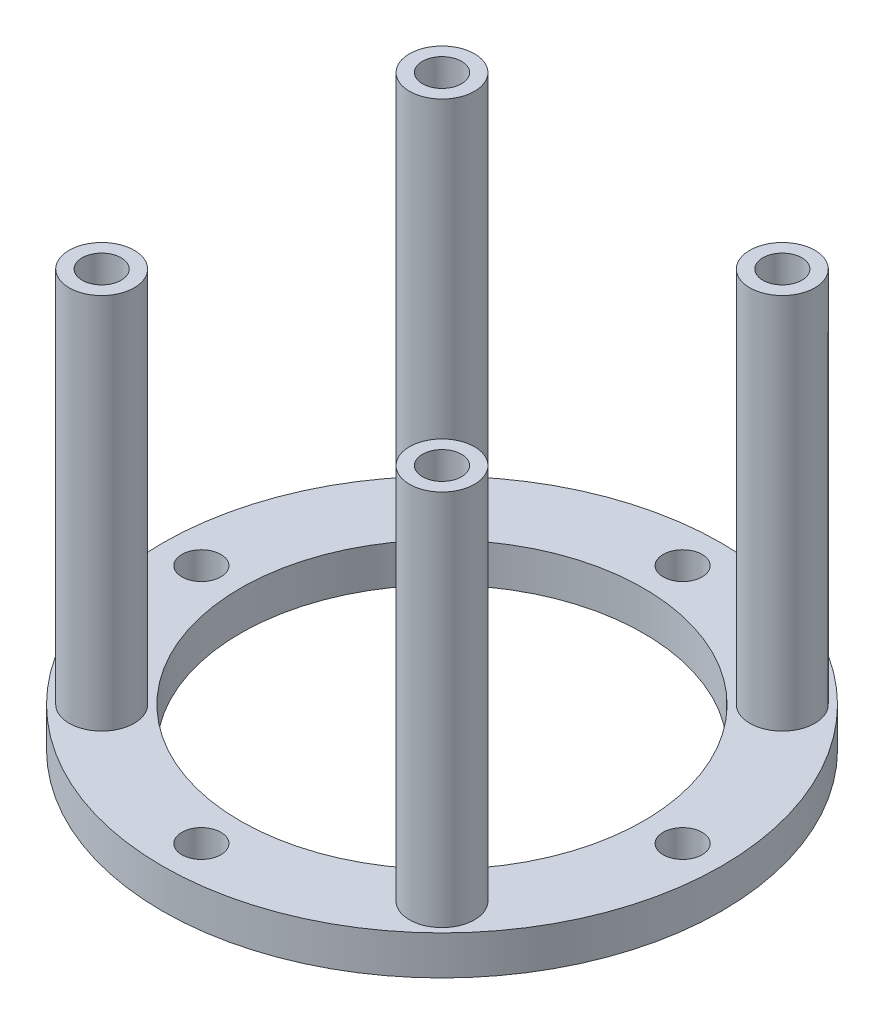
ISO-10303-21;
HEADER;
FILE_DESCRIPTION(('STEP AP214'),'2;1');
FILE_NAME('part.step','',(''),(''),'','','');
FILE_SCHEMA(('AUTOMOTIVE_DESIGN { 1 0 10303 214 1 1 1 1 }'));
ENDSEC;
DATA;
#1=APPLICATION_CONTEXT('core data for automotive mechanical design processes');
#2=APPLICATION_PROTOCOL_DEFINITION('international standard','automotive_design',2000,#1);
#3=PRODUCT_CONTEXT('',#1,'mechanical');
#4=PRODUCT('Part','Part','',(#3));
#5=PRODUCT_RELATED_PRODUCT_CATEGORY('part','',(#4));
#6=PRODUCT_DEFINITION_FORMATION('','',#4);
#7=PRODUCT_DEFINITION_CONTEXT('part definition',#1,'design');
#8=PRODUCT_DEFINITION('design','',#6,#7);
#9=PRODUCT_DEFINITION_SHAPE('','',#8);
#10=(LENGTH_UNIT() NAMED_UNIT(*) SI_UNIT(.MILLI.,.METRE.));
#11=(NAMED_UNIT(*) PLANE_ANGLE_UNIT() SI_UNIT($,.RADIAN.));
#12=(NAMED_UNIT(*) SI_UNIT($,.STERADIAN.) SOLID_ANGLE_UNIT());
#13=UNCERTAINTY_MEASURE_WITH_UNIT(LENGTH_MEASURE(1.E-05),#10,'distance_accuracy_value','');
#14=(GEOMETRIC_REPRESENTATION_CONTEXT(3) GLOBAL_UNCERTAINTY_ASSIGNED_CONTEXT((#13)) GLOBAL_UNIT_ASSIGNED_CONTEXT((#10,
#11,#12)) REPRESENTATION_CONTEXT('',''));
#15=CARTESIAN_POINT('',(0.,0.,0.));
#16=DIRECTION('',(0.,0.,1.));
#17=DIRECTION('',(1.,0.,0.));
#18=AXIS2_PLACEMENT_3D('',#15,#16,#17);
#19=CARTESIAN_POINT('',(0.,3.,0.));
#20=DIRECTION('',(0.,1.,0.));
#21=DIRECTION('',(0.,0.,1.));
#22=AXIS2_PLACEMENT_3D('',#19,#20,#21);
#23=PLANE('',#22);
#24=CARTESIAN_POINT('',(-13.0814754519511,3.,13.0814754519512));
#25=DIRECTION('',(0.,1.,0.));
#26=DIRECTION('',(0.,0.,1.));
#27=AXIS2_PLACEMENT_3D('',#24,#25,#26);
#28=CIRCLE('',#27,2.5);
#29=CARTESIAN_POINT('',(-13.0814754519511,3.,10.5814754519512));
#30=VERTEX_POINT('',#29);
#31=EDGE_CURVE('E118',#30,#30,#28,.T.);
#32=ORIENTED_EDGE('',*,*,#31,.F.);
#33=EDGE_LOOP('',(#32));
#34=FACE_BOUND('',#33,.T.);
#35=CARTESIAN_POINT('',(13.0814754519512,3.,13.0814754519511));
#36=DIRECTION('',(0.,1.,0.));
#37=DIRECTION('',(0.,0.,1.));
#38=AXIS2_PLACEMENT_3D('',#35,#36,#37);
#39=CIRCLE('',#38,2.5);
#40=CARTESIAN_POINT('',(13.0814754519512,3.,10.5814754519511));
#41=VERTEX_POINT('',#40);
#42=EDGE_CURVE('E110',#41,#41,#39,.T.);
#43=ORIENTED_EDGE('',*,*,#42,.F.);
#44=EDGE_LOOP('',(#43));
#45=FACE_BOUND('',#44,.T.);
#46=CARTESIAN_POINT('',(13.0814754519511,3.,-13.0814754519512));
#47=DIRECTION('',(0.,1.,0.));
#48=DIRECTION('',(0.,0.,1.));
#49=AXIS2_PLACEMENT_3D('',#46,#47,#48);
#50=CIRCLE('',#49,2.5);
#51=CARTESIAN_POINT('',(13.0814754519511,3.,-15.5814754519512));
#52=VERTEX_POINT('',#51);
#53=EDGE_CURVE('E102',#52,#52,#50,.T.);
#54=ORIENTED_EDGE('',*,*,#53,.F.);
#55=EDGE_LOOP('',(#54));
#56=FACE_BOUND('',#55,.T.);
#57=CARTESIAN_POINT('',(-13.0814754519512,3.,-13.0814754519511));
#58=DIRECTION('',(0.,1.,0.));
#59=DIRECTION('',(0.,0.,1.));
#60=AXIS2_PLACEMENT_3D('',#57,#58,#59);
#61=CIRCLE('',#60,2.5);
#62=CARTESIAN_POINT('',(-13.0814754519512,3.,-15.5814754519511));
#63=VERTEX_POINT('',#62);
#64=EDGE_CURVE('E98',#63,#63,#61,.T.);
#65=ORIENTED_EDGE('',*,*,#64,.F.);
#66=EDGE_LOOP('',(#65));
#67=FACE_BOUND('',#66,.T.);
#68=CARTESIAN_POINT('',(0.,3.,18.5));
#69=DIRECTION('',(0.,1.,0.));
#70=DIRECTION('',(0.,0.,1.));
#71=AXIS2_PLACEMENT_3D('',#68,#69,#70);
#72=CIRCLE('',#71,1.5);
#73=CARTESIAN_POINT('',(0.,3.,20.));
#74=VERTEX_POINT('',#73);
#75=EDGE_CURVE('E78',#74,#74,#72,.T.);
#76=ORIENTED_EDGE('',*,*,#75,.F.);
#77=EDGE_LOOP('',(#76));
#78=FACE_BOUND('',#77,.T.);
#79=CARTESIAN_POINT('',(0.,3.,-18.5));
#80=DIRECTION('',(0.,1.,0.));
#81=DIRECTION('',(0.,0.,1.));
#82=AXIS2_PLACEMENT_3D('',#79,#80,#81);
#83=CIRCLE('',#82,1.5);
#84=CARTESIAN_POINT('',(0.,3.,-17.));
#85=VERTEX_POINT('',#84);
#86=EDGE_CURVE('E62',#85,#85,#83,.T.);
#87=ORIENTED_EDGE('',*,*,#86,.F.);
#88=EDGE_LOOP('',(#87));
#89=FACE_BOUND('',#88,.T.);
#90=CARTESIAN_POINT('',(0.,3.,0.));
#91=DIRECTION('',(0.,1.,0.));
#92=DIRECTION('',(0.,0.,1.));
#93=AXIS2_PLACEMENT_3D('',#90,#91,#92);
#94=CIRCLE('',#93,21.5);
#95=CARTESIAN_POINT('',(0.,3.,21.5));
#96=VERTEX_POINT('',#95);
#97=EDGE_CURVE('E10',#96,#96,#94,.T.);
#98=ORIENTED_EDGE('',*,*,#97,.T.);
#99=EDGE_LOOP('',(#98));
#100=FACE_BOUND('',#99,.T.);
#101=CARTESIAN_POINT('',(0.,3.,0.));
#102=DIRECTION('',(0.,1.,0.));
#103=DIRECTION('',(0.,0.,1.));
#104=AXIS2_PLACEMENT_3D('',#101,#102,#103);
#105=CIRCLE('',#104,15.5);
#106=CARTESIAN_POINT('',(0.,3.,15.5));
#107=VERTEX_POINT('',#106);
#108=EDGE_CURVE('E56',#107,#107,#105,.T.);
#109=ORIENTED_EDGE('',*,*,#108,.F.);
#110=EDGE_LOOP('',(#109));
#111=FACE_BOUND('',#110,.T.);
#112=CARTESIAN_POINT('',(18.5,3.,0.));
#113=DIRECTION('',(0.,1.,0.));
#114=DIRECTION('',(0.,0.,1.));
#115=AXIS2_PLACEMENT_3D('',#112,#113,#114);
#116=CIRCLE('',#115,1.5);
#117=CARTESIAN_POINT('',(18.5,3.,1.5));
#118=VERTEX_POINT('',#117);
#119=EDGE_CURVE('E70',#118,#118,#116,.T.);
#120=ORIENTED_EDGE('',*,*,#119,.F.);
#121=EDGE_LOOP('',(#120));
#122=FACE_BOUND('',#121,.T.);
#123=CARTESIAN_POINT('',(-18.5,3.,0.));
#124=DIRECTION('',(0.,1.,0.));
#125=DIRECTION('',(0.,0.,1.));
#126=AXIS2_PLACEMENT_3D('',#123,#124,#125);
#127=CIRCLE('',#126,1.5);
#128=CARTESIAN_POINT('',(-18.5,3.,1.5));
#129=VERTEX_POINT('',#128);
#130=EDGE_CURVE('E86',#129,#129,#127,.T.);
#131=ORIENTED_EDGE('',*,*,#130,.F.);
#132=EDGE_LOOP('',(#131));
#133=FACE_BOUND('',#132,.T.);
#134=ADVANCED_FACE('F43',(#34,#45,#56,#67,#78,#89,#100,#111,#122,#133),#23,.T.);
#135=CARTESIAN_POINT('',(0.,0.,0.));
#136=DIRECTION('',(0.,1.,0.));
#137=DIRECTION('',(0.,0.,1.));
#138=AXIS2_PLACEMENT_3D('',#135,#136,#137);
#139=PLANE('',#138);
#140=CARTESIAN_POINT('',(0.,0.,0.));
#141=DIRECTION('',(0.,1.,0.));
#142=DIRECTION('',(0.,0.,1.));
#143=AXIS2_PLACEMENT_3D('',#140,#141,#142);
#144=CIRCLE('',#143,21.5);
#145=CARTESIAN_POINT('',(0.,0.,21.5));
#146=VERTEX_POINT('',#145);
#147=EDGE_CURVE('E47',#146,#146,#144,.T.);
#148=ORIENTED_EDGE('',*,*,#147,.F.);
#149=EDGE_LOOP('',(#148));
#150=FACE_BOUND('',#149,.T.);
#151=CARTESIAN_POINT('',(0.,0.,0.));
#152=DIRECTION('',(0.,1.,0.));
#153=DIRECTION('',(0.,0.,1.));
#154=AXIS2_PLACEMENT_3D('',#151,#152,#153);
#155=CIRCLE('',#154,15.5);
#156=CARTESIAN_POINT('',(0.,0.,15.5));
#157=VERTEX_POINT('',#156);
#158=EDGE_CURVE('E58',#157,#157,#155,.T.);
#159=ORIENTED_EDGE('',*,*,#158,.T.);
#160=EDGE_LOOP('',(#159));
#161=FACE_BOUND('',#160,.T.);
#162=CARTESIAN_POINT('',(0.,0.,-18.5));
#163=DIRECTION('',(0.,1.,0.));
#164=DIRECTION('',(0.,0.,1.));
#165=AXIS2_PLACEMENT_3D('',#162,#163,#164);
#166=CIRCLE('',#165,1.5);
#167=CARTESIAN_POINT('',(0.,0.,-17.));
#168=VERTEX_POINT('',#167);
#169=EDGE_CURVE('E66',#168,#168,#166,.T.);
#170=ORIENTED_EDGE('',*,*,#169,.T.);
#171=EDGE_LOOP('',(#170));
#172=FACE_BOUND('',#171,.T.);
#173=CARTESIAN_POINT('',(18.5,0.,0.));
#174=DIRECTION('',(0.,1.,0.));
#175=DIRECTION('',(0.,0.,1.));
#176=AXIS2_PLACEMENT_3D('',#173,#174,#175);
#177=CIRCLE('',#176,1.5);
#178=CARTESIAN_POINT('',(18.5,0.,1.5));
#179=VERTEX_POINT('',#178);
#180=EDGE_CURVE('E74',#179,#179,#177,.T.);
#181=ORIENTED_EDGE('',*,*,#180,.T.);
#182=EDGE_LOOP('',(#181));
#183=FACE_BOUND('',#182,.T.);
#184=CARTESIAN_POINT('',(0.,0.,18.5));
#185=DIRECTION('',(0.,1.,0.));
#186=DIRECTION('',(0.,0.,1.));
#187=AXIS2_PLACEMENT_3D('',#184,#185,#186);
#188=CIRCLE('',#187,1.5);
#189=CARTESIAN_POINT('',(0.,0.,20.));
#190=VERTEX_POINT('',#189);
#191=EDGE_CURVE('E82',#190,#190,#188,.T.);
#192=ORIENTED_EDGE('',*,*,#191,.T.);
#193=EDGE_LOOP('',(#192));
#194=FACE_BOUND('',#193,.T.);
#195=CARTESIAN_POINT('',(-18.5,0.,0.));
#196=DIRECTION('',(0.,1.,0.));
#197=DIRECTION('',(0.,0.,1.));
#198=AXIS2_PLACEMENT_3D('',#195,#196,#197);
#199=CIRCLE('',#198,1.5);
#200=CARTESIAN_POINT('',(-18.5,0.,1.5));
#201=VERTEX_POINT('',#200);
#202=EDGE_CURVE('E90',#201,#201,#199,.T.);
#203=ORIENTED_EDGE('',*,*,#202,.T.);
#204=EDGE_LOOP('',(#203));
#205=FACE_BOUND('',#204,.T.);
#206=ADVANCED_FACE('F180',(#150,#161,#172,#183,#194,#205),#139,.F.);
#207=CARTESIAN_POINT('',(0.,3.,0.));
#208=DIRECTION('',(0.,-1.,0.));
#209=DIRECTION('',(0.,0.,-1.));
#210=AXIS2_PLACEMENT_3D('',#207,#208,#209);
#211=CYLINDRICAL_SURFACE('',#210,21.5);
#212=ORIENTED_EDGE('',*,*,#97,.F.);
#213=EDGE_LOOP('',(#212));
#214=FACE_BOUND('',#213,.T.);
#215=ORIENTED_EDGE('',*,*,#147,.T.);
#216=EDGE_LOOP('',(#215));
#217=FACE_BOUND('',#216,.T.);
#218=ADVANCED_FACE('F45',(#214,#217),#211,.T.);
#219=CARTESIAN_POINT('',(0.,3.,0.));
#220=DIRECTION('',(0.,-1.,0.));
#221=DIRECTION('',(0.,0.,-1.));
#222=AXIS2_PLACEMENT_3D('',#219,#220,#221);
#223=CYLINDRICAL_SURFACE('',#222,15.5);
#224=ORIENTED_EDGE('',*,*,#108,.T.);
#225=EDGE_LOOP('',(#224));
#226=FACE_BOUND('',#225,.T.);
#227=ORIENTED_EDGE('',*,*,#158,.F.);
#228=EDGE_LOOP('',(#227));
#229=FACE_BOUND('',#228,.T.);
#230=ADVANCED_FACE('F208',(#226,#229),#223,.F.);
#231=CARTESIAN_POINT('',(0.,3.,-18.5));
#232=DIRECTION('',(0.,-1.,0.));
#233=DIRECTION('',(0.,0.,-1.));
#234=AXIS2_PLACEMENT_3D('',#231,#232,#233);
#235=CYLINDRICAL_SURFACE('',#234,1.5);
#236=ORIENTED_EDGE('',*,*,#86,.T.);
#237=EDGE_LOOP('',(#236));
#238=FACE_BOUND('',#237,.T.);
#239=ORIENTED_EDGE('',*,*,#169,.F.);
#240=EDGE_LOOP('',(#239));
#241=FACE_BOUND('',#240,.T.);
#242=ADVANCED_FACE('F215',(#238,#241),#235,.F.);
#243=CARTESIAN_POINT('',(18.5,3.,0.));
#244=DIRECTION('',(0.,-1.,0.));
#245=DIRECTION('',(0.,0.,-1.));
#246=AXIS2_PLACEMENT_3D('',#243,#244,#245);
#247=CYLINDRICAL_SURFACE('',#246,1.5);
#248=ORIENTED_EDGE('',*,*,#119,.T.);
#249=EDGE_LOOP('',(#248));
#250=FACE_BOUND('',#249,.T.);
#251=ORIENTED_EDGE('',*,*,#180,.F.);
#252=EDGE_LOOP('',(#251));
#253=FACE_BOUND('',#252,.T.);
#254=ADVANCED_FACE('F219',(#250,#253),#247,.F.);
#255=CARTESIAN_POINT('',(0.,3.,18.5));
#256=DIRECTION('',(0.,-1.,0.));
#257=DIRECTION('',(0.,0.,-1.));
#258=AXIS2_PLACEMENT_3D('',#255,#256,#257);
#259=CYLINDRICAL_SURFACE('',#258,1.5);
#260=ORIENTED_EDGE('',*,*,#75,.T.);
#261=EDGE_LOOP('',(#260));
#262=FACE_BOUND('',#261,.T.);
#263=ORIENTED_EDGE('',*,*,#191,.F.);
#264=EDGE_LOOP('',(#263));
#265=FACE_BOUND('',#264,.T.);
#266=ADVANCED_FACE('F199',(#262,#265),#259,.F.);
#267=CARTESIAN_POINT('',(-18.5,3.,0.));
#268=DIRECTION('',(0.,-1.,0.));
#269=DIRECTION('',(0.,0.,-1.));
#270=AXIS2_PLACEMENT_3D('',#267,#268,#269);
#271=CYLINDRICAL_SURFACE('',#270,1.5);
#272=ORIENTED_EDGE('',*,*,#130,.T.);
#273=EDGE_LOOP('',(#272));
#274=FACE_BOUND('',#273,.T.);
#275=ORIENTED_EDGE('',*,*,#202,.F.);
#276=EDGE_LOOP('',(#275));
#277=FACE_BOUND('',#276,.T.);
#278=ADVANCED_FACE('F195',(#274,#277),#271,.F.);
#279=CARTESIAN_POINT('',(-13.0814754519512,32.,-13.0814754519511));
#280=DIRECTION('',(0.,-1.,0.));
#281=DIRECTION('',(0.,0.,-1.));
#282=AXIS2_PLACEMENT_3D('',#279,#280,#281);
#283=CYLINDRICAL_SURFACE('',#282,2.5);
#284=CARTESIAN_POINT('',(-13.0814754519512,32.,-13.0814754519511));
#285=DIRECTION('',(0.,1.,0.));
#286=DIRECTION('',(0.,0.,1.));
#287=AXIS2_PLACEMENT_3D('',#284,#285,#286);
#288=CIRCLE('',#287,2.5);
#289=CARTESIAN_POINT('',(-13.0814754519512,32.,-15.5814754519511));
#290=VERTEX_POINT('',#289);
#291=EDGE_CURVE('E94',#290,#290,#288,.T.);
#292=CARTESIAN_POINT('',(-13.0814754519512,32.,-15.5814754519511));
#293=CARTESIAN_POINT('',(-13.0814754519512,31.6979166666667,-15.5814754519511));
#294=CARTESIAN_POINT('',(-13.0814754519512,31.3958333333333,-15.5814754519511));
#295=CARTESIAN_POINT('',(-13.0814754519512,30.7916666666667,-15.5814754519511));
#296=CARTESIAN_POINT('',(-13.0814754519512,30.4895833333333,-15.5814754519511));
#297=CARTESIAN_POINT('',(-13.0814754519512,29.8854166666667,-15.5814754519511));
#298=CARTESIAN_POINT('',(-13.0814754519512,29.5833333333333,-15.5814754519511));
#299=CARTESIAN_POINT('',(-13.0814754519512,28.9791666666667,-15.5814754519511));
#300=CARTESIAN_POINT('',(-13.0814754519512,28.6770833333333,-15.5814754519511));
#301=CARTESIAN_POINT('',(-13.0814754519512,28.0729166666667,-15.5814754519511));
#302=CARTESIAN_POINT('',(-13.0814754519512,27.7708333333333,-15.5814754519511));
#303=CARTESIAN_POINT('',(-13.0814754519512,27.1666666666667,-15.5814754519511));
#304=CARTESIAN_POINT('',(-13.0814754519512,26.8645833333333,-15.5814754519511));
#305=CARTESIAN_POINT('',(-13.0814754519512,26.2604166666667,-15.5814754519511));
#306=CARTESIAN_POINT('',(-13.0814754519512,25.9583333333333,-15.5814754519511));
#307=CARTESIAN_POINT('',(-13.0814754519512,25.3541666666667,-15.5814754519511));
#308=CARTESIAN_POINT('',(-13.0814754519512,25.0520833333333,-15.5814754519511));
#309=CARTESIAN_POINT('',(-13.0814754519512,24.4479166666667,-15.5814754519511));
#310=CARTESIAN_POINT('',(-13.0814754519512,24.1458333333333,-15.5814754519511));
#311=CARTESIAN_POINT('',(-13.0814754519512,23.5416666666667,-15.5814754519511));
#312=CARTESIAN_POINT('',(-13.0814754519512,23.2395833333333,-15.5814754519511));
#313=CARTESIAN_POINT('',(-13.0814754519512,22.6354166666667,-15.5814754519511));
#314=CARTESIAN_POINT('',(-13.0814754519512,22.3333333333333,-15.5814754519511));
#315=CARTESIAN_POINT('',(-13.0814754519512,21.7291666666667,-15.5814754519511));
#316=CARTESIAN_POINT('',(-13.0814754519512,21.4270833333333,-15.5814754519511));
#317=CARTESIAN_POINT('',(-13.0814754519512,20.8229166666667,-15.5814754519511));
#318=CARTESIAN_POINT('',(-13.0814754519512,20.5208333333333,-15.5814754519511));
#319=CARTESIAN_POINT('',(-13.0814754519512,19.9166666666667,-15.5814754519511));
#320=CARTESIAN_POINT('',(-13.0814754519512,19.6145833333333,-15.5814754519511));
#321=CARTESIAN_POINT('',(-13.0814754519512,19.0104166666667,-15.5814754519511));
#322=CARTESIAN_POINT('',(-13.0814754519512,18.7083333333333,-15.5814754519511));
#323=CARTESIAN_POINT('',(-13.0814754519512,18.1041666666667,-15.5814754519511));
#324=CARTESIAN_POINT('',(-13.0814754519512,17.8020833333333,-15.5814754519511));
#325=CARTESIAN_POINT('',(-13.0814754519512,17.1979166666667,-15.5814754519511));
#326=CARTESIAN_POINT('',(-13.0814754519512,16.8958333333333,-15.5814754519511));
#327=CARTESIAN_POINT('',(-13.0814754519512,16.2916666666667,-15.5814754519511));
#328=CARTESIAN_POINT('',(-13.0814754519512,15.9895833333333,-15.5814754519511));
#329=CARTESIAN_POINT('',(-13.0814754519512,15.3854166666667,-15.5814754519511));
#330=CARTESIAN_POINT('',(-13.0814754519512,15.0833333333333,-15.5814754519511));
#331=CARTESIAN_POINT('',(-13.0814754519512,14.4791666666667,-15.5814754519511));
#332=CARTESIAN_POINT('',(-13.0814754519512,14.1770833333333,-15.5814754519511));
#333=CARTESIAN_POINT('',(-13.0814754519512,13.5729166666667,-15.5814754519511));
#334=CARTESIAN_POINT('',(-13.0814754519512,13.2708333333333,-15.5814754519511));
#335=CARTESIAN_POINT('',(-13.0814754519512,12.6666666666667,-15.5814754519511));
#336=CARTESIAN_POINT('',(-13.0814754519512,12.3645833333333,-15.5814754519511));
#337=CARTESIAN_POINT('',(-13.0814754519512,11.7604166666667,-15.5814754519511));
#338=CARTESIAN_POINT('',(-13.0814754519512,11.4583333333333,-15.5814754519511));
#339=CARTESIAN_POINT('',(-13.0814754519512,10.8541666666667,-15.5814754519511));
#340=CARTESIAN_POINT('',(-13.0814754519512,10.5520833333333,-15.5814754519511));
#341=CARTESIAN_POINT('',(-13.0814754519512,9.94791666666667,-15.5814754519511));
#342=CARTESIAN_POINT('',(-13.0814754519512,9.64583333333333,-15.5814754519511));
#343=CARTESIAN_POINT('',(-13.0814754519512,9.04166666666666,-15.5814754519511));
#344=CARTESIAN_POINT('',(-13.0814754519512,8.73958333333333,-15.5814754519511));
#345=CARTESIAN_POINT('',(-13.0814754519512,8.13541666666667,-15.5814754519511));
#346=CARTESIAN_POINT('',(-13.0814754519512,7.83333333333333,-15.5814754519511));
#347=CARTESIAN_POINT('',(-13.0814754519512,7.22916666666667,-15.5814754519511));
#348=CARTESIAN_POINT('',(-13.0814754519512,6.92708333333333,-15.5814754519511));
#349=CARTESIAN_POINT('',(-13.0814754519512,6.32291666666667,-15.5814754519511));
#350=CARTESIAN_POINT('',(-13.0814754519512,6.02083333333333,-15.5814754519511));
#351=CARTESIAN_POINT('',(-13.0814754519512,5.41666666666667,-15.5814754519511));
#352=CARTESIAN_POINT('',(-13.0814754519512,5.11458333333333,-15.5814754519511));
#353=CARTESIAN_POINT('',(-13.0814754519512,4.51041666666667,-15.5814754519511));
#354=CARTESIAN_POINT('',(-13.0814754519512,4.20833333333333,-15.5814754519511));
#355=CARTESIAN_POINT('',(-13.0814754519512,3.60416666666667,-15.5814754519511));
#356=CARTESIAN_POINT('',(-13.0814754519512,3.30208333333333,-15.5814754519511));
#357=CARTESIAN_POINT('',(-13.0814754519512,3.,-15.5814754519511));
#358=B_SPLINE_CURVE_WITH_KNOTS('',3,(#292,#293,#294,#295,#296,#297,#298,#299,#300,#301,#302,
#303,#304,#305,#306,#307,#308,#309,#310,#311,#312,#313,#314,#315,#316,#317,#318,#319,#320,#321,
#322,#323,#324,#325,#326,#327,#328,#329,#330,#331,#332,#333,#334,#335,#336,#337,#338,#339,#340,
#341,#342,#343,#344,#345,#346,#347,#348,#349,#350,#351,#352,#353,#354,#355,#356,#357),
.UNSPECIFIED.,.F.,.F.,(4,2,2,2,2,2,2,2,2,2,2,2,2,2,2,2,2,2,2,2,2,2,2,2,2,2,2,2,2,2,2,2,4),(0.,
0.906250000000004,1.8125,2.71875,3.625,4.53125,5.4375,6.34375,7.25,8.15625,9.0625,9.96875,
10.875,11.78125,12.6875,13.59375,14.5,15.40625,16.3125,17.21875,18.125,19.03125,19.9375,
20.84375,21.75,22.65625,23.5625,24.46875,25.375,26.28125,27.1875,28.09375,29.),.UNSPECIFIED.);
#359=EDGE_CURVE('BSEAM198',#290,#63,#358,.T.);
#360=ORIENTED_EDGE('',*,*,#291,.F.);
#361=ORIENTED_EDGE('',*,*,#64,.T.);
#362=ORIENTED_EDGE('',*,*,#359,.T.);
#363=ORIENTED_EDGE('',*,*,#359,.F.);
#364=EDGE_LOOP('',(#360,#362,#361,#363));
#365=FACE_BOUND('',#364,.T.);
#366=ADVANCED_FACE('F198',(#365),#283,.T.);
#367=CARTESIAN_POINT('',(-13.0814754519512,32.,-13.0814754519511));
#368=DIRECTION('',(0.,1.,0.));
#369=DIRECTION('',(0.,0.,1.));
#370=AXIS2_PLACEMENT_3D('',#367,#368,#369);
#371=PLANE('',#370);
#372=CARTESIAN_POINT('',(-13.0814754519512,32.,-13.0814754519511));
#373=DIRECTION('',(0.,1.,0.));
#374=DIRECTION('',(0.,0.,1.));
#375=AXIS2_PLACEMENT_3D('',#372,#373,#374);
#376=CIRCLE('',#375,1.5);
#377=CARTESIAN_POINT('',(-13.0814754519512,32.,-11.5814754519511));
#378=VERTEX_POINT('',#377);
#379=EDGE_CURVE('E130',#378,#378,#376,.T.);
#380=ORIENTED_EDGE('',*,*,#379,.F.);
#381=EDGE_LOOP('',(#380));
#382=FACE_BOUND('',#381,.T.);
#383=ORIENTED_EDGE('',*,*,#291,.T.);
#384=EDGE_LOOP('',(#383));
#385=FACE_BOUND('',#384,.T.);
#386=ADVANCED_FACE('F174',(#382,#385),#371,.T.);
#387=CARTESIAN_POINT('',(13.0814754519511,32.,-13.0814754519512));
#388=DIRECTION('',(0.,-1.,0.));
#389=DIRECTION('',(0.,0.,-1.));
#390=AXIS2_PLACEMENT_3D('',#387,#388,#389);
#391=CYLINDRICAL_SURFACE('',#390,2.5);
#392=CARTESIAN_POINT('',(13.0814754519511,32.,-13.0814754519512));
#393=DIRECTION('',(0.,1.,0.));
#394=DIRECTION('',(0.,0.,1.));
#395=AXIS2_PLACEMENT_3D('',#392,#393,#394);
#396=CIRCLE('',#395,2.5);
#397=CARTESIAN_POINT('',(13.0814754519511,32.,-15.5814754519512));
#398=VERTEX_POINT('',#397);
#399=EDGE_CURVE('E106',#398,#398,#396,.T.);
#400=CARTESIAN_POINT('',(13.0814754519511,32.,-15.5814754519512));
#401=CARTESIAN_POINT('',(13.0814754519511,31.6979166666667,-15.5814754519512));
#402=CARTESIAN_POINT('',(13.0814754519511,31.3958333333333,-15.5814754519512));
#403=CARTESIAN_POINT('',(13.0814754519511,30.7916666666667,-15.5814754519512));
#404=CARTESIAN_POINT('',(13.0814754519511,30.4895833333333,-15.5814754519512));
#405=CARTESIAN_POINT('',(13.0814754519511,29.8854166666667,-15.5814754519512));
#406=CARTESIAN_POINT('',(13.0814754519511,29.5833333333333,-15.5814754519512));
#407=CARTESIAN_POINT('',(13.0814754519511,28.9791666666667,-15.5814754519512));
#408=CARTESIAN_POINT('',(13.0814754519511,28.6770833333333,-15.5814754519512));
#409=CARTESIAN_POINT('',(13.0814754519511,28.0729166666667,-15.5814754519512));
#410=CARTESIAN_POINT('',(13.0814754519511,27.7708333333333,-15.5814754519512));
#411=CARTESIAN_POINT('',(13.0814754519511,27.1666666666667,-15.5814754519512));
#412=CARTESIAN_POINT('',(13.0814754519511,26.8645833333333,-15.5814754519512));
#413=CARTESIAN_POINT('',(13.0814754519511,26.2604166666667,-15.5814754519512));
#414=CARTESIAN_POINT('',(13.0814754519511,25.9583333333333,-15.5814754519512));
#415=CARTESIAN_POINT('',(13.0814754519511,25.3541666666667,-15.5814754519512));
#416=CARTESIAN_POINT('',(13.0814754519511,25.0520833333333,-15.5814754519512));
#417=CARTESIAN_POINT('',(13.0814754519511,24.4479166666667,-15.5814754519512));
#418=CARTESIAN_POINT('',(13.0814754519511,24.1458333333333,-15.5814754519512));
#419=CARTESIAN_POINT('',(13.0814754519511,23.5416666666667,-15.5814754519512));
#420=CARTESIAN_POINT('',(13.0814754519511,23.2395833333333,-15.5814754519512));
#421=CARTESIAN_POINT('',(13.0814754519511,22.6354166666667,-15.5814754519512));
#422=CARTESIAN_POINT('',(13.0814754519511,22.3333333333333,-15.5814754519512));
#423=CARTESIAN_POINT('',(13.0814754519511,21.7291666666667,-15.5814754519512));
#424=CARTESIAN_POINT('',(13.0814754519511,21.4270833333333,-15.5814754519512));
#425=CARTESIAN_POINT('',(13.0814754519511,20.8229166666667,-15.5814754519512));
#426=CARTESIAN_POINT('',(13.0814754519511,20.5208333333333,-15.5814754519512));
#427=CARTESIAN_POINT('',(13.0814754519511,19.9166666666667,-15.5814754519512));
#428=CARTESIAN_POINT('',(13.0814754519511,19.6145833333333,-15.5814754519512));
#429=CARTESIAN_POINT('',(13.0814754519511,19.0104166666667,-15.5814754519512));
#430=CARTESIAN_POINT('',(13.0814754519511,18.7083333333333,-15.5814754519512));
#431=CARTESIAN_POINT('',(13.0814754519511,18.1041666666667,-15.5814754519512));
#432=CARTESIAN_POINT('',(13.0814754519511,17.8020833333333,-15.5814754519512));
#433=CARTESIAN_POINT('',(13.0814754519511,17.1979166666667,-15.5814754519512));
#434=CARTESIAN_POINT('',(13.0814754519511,16.8958333333333,-15.5814754519512));
#435=CARTESIAN_POINT('',(13.0814754519511,16.2916666666667,-15.5814754519512));
#436=CARTESIAN_POINT('',(13.0814754519511,15.9895833333333,-15.5814754519512));
#437=CARTESIAN_POINT('',(13.0814754519511,15.3854166666667,-15.5814754519512));
#438=CARTESIAN_POINT('',(13.0814754519511,15.0833333333333,-15.5814754519512));
#439=CARTESIAN_POINT('',(13.0814754519511,14.4791666666667,-15.5814754519512));
#440=CARTESIAN_POINT('',(13.0814754519511,14.1770833333333,-15.5814754519512));
#441=CARTESIAN_POINT('',(13.0814754519511,13.5729166666667,-15.5814754519512));
#442=CARTESIAN_POINT('',(13.0814754519511,13.2708333333333,-15.5814754519512));
#443=CARTESIAN_POINT('',(13.0814754519511,12.6666666666667,-15.5814754519512));
#444=CARTESIAN_POINT('',(13.0814754519511,12.3645833333333,-15.5814754519512));
#445=CARTESIAN_POINT('',(13.0814754519511,11.7604166666667,-15.5814754519512));
#446=CARTESIAN_POINT('',(13.0814754519511,11.4583333333333,-15.5814754519512));
#447=CARTESIAN_POINT('',(13.0814754519511,10.8541666666667,-15.5814754519512));
#448=CARTESIAN_POINT('',(13.0814754519511,10.5520833333333,-15.5814754519512));
#449=CARTESIAN_POINT('',(13.0814754519511,9.94791666666667,-15.5814754519512));
#450=CARTESIAN_POINT('',(13.0814754519511,9.64583333333333,-15.5814754519512));
#451=CARTESIAN_POINT('',(13.0814754519511,9.04166666666666,-15.5814754519512));
#452=CARTESIAN_POINT('',(13.0814754519511,8.73958333333333,-15.5814754519512));
#453=CARTESIAN_POINT('',(13.0814754519511,8.13541666666667,-15.5814754519512));
#454=CARTESIAN_POINT('',(13.0814754519511,7.83333333333333,-15.5814754519512));
#455=CARTESIAN_POINT('',(13.0814754519511,7.22916666666667,-15.5814754519512));
#456=CARTESIAN_POINT('',(13.0814754519511,6.92708333333333,-15.5814754519512));
#457=CARTESIAN_POINT('',(13.0814754519511,6.32291666666667,-15.5814754519512));
#458=CARTESIAN_POINT('',(13.0814754519511,6.02083333333333,-15.5814754519512));
#459=CARTESIAN_POINT('',(13.0814754519511,5.41666666666667,-15.5814754519512));
#460=CARTESIAN_POINT('',(13.0814754519511,5.11458333333333,-15.5814754519512));
#461=CARTESIAN_POINT('',(13.0814754519511,4.51041666666667,-15.5814754519512));
#462=CARTESIAN_POINT('',(13.0814754519511,4.20833333333333,-15.5814754519512));
#463=CARTESIAN_POINT('',(13.0814754519511,3.60416666666667,-15.5814754519512));
#464=CARTESIAN_POINT('',(13.0814754519511,3.30208333333333,-15.5814754519512));
#465=CARTESIAN_POINT('',(13.0814754519511,3.,-15.5814754519512));
#466=B_SPLINE_CURVE_WITH_KNOTS('',3,(#400,#401,#402,#403,#404,#405,#406,#407,#408,#409,#410,
#411,#412,#413,#414,#415,#416,#417,#418,#419,#420,#421,#422,#423,#424,#425,#426,#427,#428,#429,
#430,#431,#432,#433,#434,#435,#436,#437,#438,#439,#440,#441,#442,#443,#444,#445,#446,#447,#448,
#449,#450,#451,#452,#453,#454,#455,#456,#457,#458,#459,#460,#461,#462,#463,#464,#465),
.UNSPECIFIED.,.F.,.F.,(4,2,2,2,2,2,2,2,2,2,2,2,2,2,2,2,2,2,2,2,2,2,2,2,2,2,2,2,2,2,2,2,4),(0.,
0.906250000000004,1.8125,2.71875,3.625,4.53125,5.4375,6.34375,7.25,8.15625,9.0625,9.96875,
10.875,11.78125,12.6875,13.59375,14.5,15.40625,16.3125,17.21875,18.125,19.03125,19.9375,
20.84375,21.75,22.65625,23.5625,24.46875,25.375,26.28125,27.1875,28.09375,29.),.UNSPECIFIED.);
#467=EDGE_CURVE('BSEAM168',#398,#52,#466,.T.);
#468=ORIENTED_EDGE('',*,*,#399,.F.);
#469=ORIENTED_EDGE('',*,*,#53,.T.);
#470=ORIENTED_EDGE('',*,*,#467,.T.);
#471=ORIENTED_EDGE('',*,*,#467,.F.);
#472=EDGE_LOOP('',(#468,#470,#469,#471));
#473=FACE_BOUND('',#472,.T.);
#474=ADVANCED_FACE('F168',(#473),#391,.T.);
#475=CARTESIAN_POINT('',(13.0814754519511,32.,-13.0814754519512));
#476=DIRECTION('',(0.,1.,0.));
#477=DIRECTION('',(0.,0.,1.));
#478=AXIS2_PLACEMENT_3D('',#475,#476,#477);
#479=PLANE('',#478);
#480=CARTESIAN_POINT('',(13.0814754519511,32.,-13.0814754519512));
#481=DIRECTION('',(0.,1.,0.));
#482=DIRECTION('',(0.,0.,1.));
#483=AXIS2_PLACEMENT_3D('',#480,#481,#482);
#484=CIRCLE('',#483,1.5);
#485=CARTESIAN_POINT('',(13.0814754519511,32.,-11.5814754519512));
#486=VERTEX_POINT('',#485);
#487=EDGE_CURVE('E134',#486,#486,#484,.T.);
#488=ORIENTED_EDGE('',*,*,#487,.F.);
#489=EDGE_LOOP('',(#488));
#490=FACE_BOUND('',#489,.T.);
#491=ORIENTED_EDGE('',*,*,#399,.T.);
#492=EDGE_LOOP('',(#491));
#493=FACE_BOUND('',#492,.T.);
#494=ADVANCED_FACE('F164',(#490,#493),#479,.T.);
#495=CARTESIAN_POINT('',(13.0814754519512,32.,13.0814754519511));
#496=DIRECTION('',(0.,-1.,0.));
#497=DIRECTION('',(0.,0.,-1.));
#498=AXIS2_PLACEMENT_3D('',#495,#496,#497);
#499=CYLINDRICAL_SURFACE('',#498,2.5);
#500=CARTESIAN_POINT('',(13.0814754519512,32.,13.0814754519511));
#501=DIRECTION('',(0.,1.,0.));
#502=DIRECTION('',(0.,0.,1.));
#503=AXIS2_PLACEMENT_3D('',#500,#501,#502);
#504=CIRCLE('',#503,2.5);
#505=CARTESIAN_POINT('',(13.0814754519512,32.,10.5814754519511));
#506=VERTEX_POINT('',#505);
#507=EDGE_CURVE('E114',#506,#506,#504,.T.);
#508=CARTESIAN_POINT('',(13.0814754519512,32.,10.5814754519511));
#509=CARTESIAN_POINT('',(13.0814754519512,31.6979166666667,10.5814754519511));
#510=CARTESIAN_POINT('',(13.0814754519512,31.3958333333333,10.5814754519511));
#511=CARTESIAN_POINT('',(13.0814754519512,30.7916666666667,10.5814754519511));
#512=CARTESIAN_POINT('',(13.0814754519512,30.4895833333333,10.5814754519511));
#513=CARTESIAN_POINT('',(13.0814754519512,29.8854166666667,10.5814754519511));
#514=CARTESIAN_POINT('',(13.0814754519512,29.5833333333333,10.5814754519511));
#515=CARTESIAN_POINT('',(13.0814754519512,28.9791666666667,10.5814754519511));
#516=CARTESIAN_POINT('',(13.0814754519512,28.6770833333333,10.5814754519511));
#517=CARTESIAN_POINT('',(13.0814754519512,28.0729166666667,10.5814754519511));
#518=CARTESIAN_POINT('',(13.0814754519512,27.7708333333333,10.5814754519511));
#519=CARTESIAN_POINT('',(13.0814754519512,27.1666666666667,10.5814754519511));
#520=CARTESIAN_POINT('',(13.0814754519512,26.8645833333333,10.5814754519511));
#521=CARTESIAN_POINT('',(13.0814754519512,26.2604166666667,10.5814754519511));
#522=CARTESIAN_POINT('',(13.0814754519512,25.9583333333333,10.5814754519511));
#523=CARTESIAN_POINT('',(13.0814754519512,25.3541666666667,10.5814754519511));
#524=CARTESIAN_POINT('',(13.0814754519512,25.0520833333333,10.5814754519511));
#525=CARTESIAN_POINT('',(13.0814754519512,24.4479166666667,10.5814754519511));
#526=CARTESIAN_POINT('',(13.0814754519512,24.1458333333333,10.5814754519511));
#527=CARTESIAN_POINT('',(13.0814754519512,23.5416666666667,10.5814754519511));
#528=CARTESIAN_POINT('',(13.0814754519512,23.2395833333333,10.5814754519511));
#529=CARTESIAN_POINT('',(13.0814754519512,22.6354166666667,10.5814754519511));
#530=CARTESIAN_POINT('',(13.0814754519512,22.3333333333333,10.5814754519511));
#531=CARTESIAN_POINT('',(13.0814754519512,21.7291666666667,10.5814754519511));
#532=CARTESIAN_POINT('',(13.0814754519512,21.4270833333333,10.5814754519511));
#533=CARTESIAN_POINT('',(13.0814754519512,20.8229166666667,10.5814754519511));
#534=CARTESIAN_POINT('',(13.0814754519512,20.5208333333333,10.5814754519511));
#535=CARTESIAN_POINT('',(13.0814754519512,19.9166666666667,10.5814754519511));
#536=CARTESIAN_POINT('',(13.0814754519512,19.6145833333333,10.5814754519511));
#537=CARTESIAN_POINT('',(13.0814754519512,19.0104166666667,10.5814754519511));
#538=CARTESIAN_POINT('',(13.0814754519512,18.7083333333333,10.5814754519511));
#539=CARTESIAN_POINT('',(13.0814754519512,18.1041666666667,10.5814754519511));
#540=CARTESIAN_POINT('',(13.0814754519512,17.8020833333333,10.5814754519511));
#541=CARTESIAN_POINT('',(13.0814754519512,17.1979166666667,10.5814754519511));
#542=CARTESIAN_POINT('',(13.0814754519512,16.8958333333333,10.5814754519511));
#543=CARTESIAN_POINT('',(13.0814754519512,16.2916666666667,10.5814754519511));
#544=CARTESIAN_POINT('',(13.0814754519512,15.9895833333333,10.5814754519511));
#545=CARTESIAN_POINT('',(13.0814754519512,15.3854166666667,10.5814754519511));
#546=CARTESIAN_POINT('',(13.0814754519512,15.0833333333333,10.5814754519511));
#547=CARTESIAN_POINT('',(13.0814754519512,14.4791666666667,10.5814754519511));
#548=CARTESIAN_POINT('',(13.0814754519512,14.1770833333333,10.5814754519511));
#549=CARTESIAN_POINT('',(13.0814754519512,13.5729166666667,10.5814754519511));
#550=CARTESIAN_POINT('',(13.0814754519512,13.2708333333333,10.5814754519511));
#551=CARTESIAN_POINT('',(13.0814754519512,12.6666666666667,10.5814754519511));
#552=CARTESIAN_POINT('',(13.0814754519512,12.3645833333333,10.5814754519511));
#553=CARTESIAN_POINT('',(13.0814754519512,11.7604166666667,10.5814754519511));
#554=CARTESIAN_POINT('',(13.0814754519512,11.4583333333333,10.5814754519511));
#555=CARTESIAN_POINT('',(13.0814754519512,10.8541666666667,10.5814754519511));
#556=CARTESIAN_POINT('',(13.0814754519512,10.5520833333333,10.5814754519511));
#557=CARTESIAN_POINT('',(13.0814754519512,9.94791666666667,10.5814754519511));
#558=CARTESIAN_POINT('',(13.0814754519512,9.64583333333333,10.5814754519511));
#559=CARTESIAN_POINT('',(13.0814754519512,9.04166666666666,10.5814754519511));
#560=CARTESIAN_POINT('',(13.0814754519512,8.73958333333333,10.5814754519511));
#561=CARTESIAN_POINT('',(13.0814754519512,8.13541666666667,10.5814754519511));
#562=CARTESIAN_POINT('',(13.0814754519512,7.83333333333333,10.5814754519511));
#563=CARTESIAN_POINT('',(13.0814754519512,7.22916666666667,10.5814754519511));
#564=CARTESIAN_POINT('',(13.0814754519512,6.92708333333333,10.5814754519511));
#565=CARTESIAN_POINT('',(13.0814754519512,6.32291666666667,10.5814754519511));
#566=CARTESIAN_POINT('',(13.0814754519512,6.02083333333333,10.5814754519511));
#567=CARTESIAN_POINT('',(13.0814754519512,5.41666666666667,10.5814754519511));
#568=CARTESIAN_POINT('',(13.0814754519512,5.11458333333333,10.5814754519511));
#569=CARTESIAN_POINT('',(13.0814754519512,4.51041666666667,10.5814754519511));
#570=CARTESIAN_POINT('',(13.0814754519512,4.20833333333333,10.5814754519511));
#571=CARTESIAN_POINT('',(13.0814754519512,3.60416666666667,10.5814754519511));
#572=CARTESIAN_POINT('',(13.0814754519512,3.30208333333333,10.5814754519511));
#573=CARTESIAN_POINT('',(13.0814754519512,3.,10.5814754519511));
#574=B_SPLINE_CURVE_WITH_KNOTS('',3,(#508,#509,#510,#511,#512,#513,#514,#515,#516,#517,#518,
#519,#520,#521,#522,#523,#524,#525,#526,#527,#528,#529,#530,#531,#532,#533,#534,#535,#536,#537,
#538,#539,#540,#541,#542,#543,#544,#545,#546,#547,#548,#549,#550,#551,#552,#553,#554,#555,#556,
#557,#558,#559,#560,#561,#562,#563,#564,#565,#566,#567,#568,#569,#570,#571,#572,#573),
.UNSPECIFIED.,.F.,.F.,(4,2,2,2,2,2,2,2,2,2,2,2,2,2,2,2,2,2,2,2,2,2,2,2,2,2,2,2,2,2,2,2,4),(0.,
0.906250000000004,1.8125,2.71875,3.625,4.53125,5.4375,6.34375,7.25,8.15625,9.0625,9.96875,
10.875,11.78125,12.6875,13.59375,14.5,15.40625,16.3125,17.21875,18.125,19.03125,19.9375,
20.84375,21.75,22.65625,23.5625,24.46875,25.375,26.28125,27.1875,28.09375,29.),.UNSPECIFIED.);
#575=EDGE_CURVE('BSEAM167',#506,#41,#574,.T.);
#576=ORIENTED_EDGE('',*,*,#507,.F.);
#577=ORIENTED_EDGE('',*,*,#42,.T.);
#578=ORIENTED_EDGE('',*,*,#575,.T.);
#579=ORIENTED_EDGE('',*,*,#575,.F.);
#580=EDGE_LOOP('',(#576,#578,#577,#579));
#581=FACE_BOUND('',#580,.T.);
#582=ADVANCED_FACE('F167',(#581),#499,.T.);
#583=CARTESIAN_POINT('',(13.0814754519512,32.,13.0814754519511));
#584=DIRECTION('',(0.,1.,0.));
#585=DIRECTION('',(0.,0.,1.));
#586=AXIS2_PLACEMENT_3D('',#583,#584,#585);
#587=PLANE('',#586);
#588=CARTESIAN_POINT('',(13.0814754519512,32.,13.0814754519511));
#589=DIRECTION('',(0.,1.,0.));
#590=DIRECTION('',(0.,0.,1.));
#591=AXIS2_PLACEMENT_3D('',#588,#589,#590);
#592=CIRCLE('',#591,1.5);
#593=CARTESIAN_POINT('',(13.0814754519512,32.,14.5814754519511));
#594=VERTEX_POINT('',#593);
#595=EDGE_CURVE('E150',#594,#594,#592,.T.);
#596=ORIENTED_EDGE('',*,*,#595,.F.);
#597=EDGE_LOOP('',(#596));
#598=FACE_BOUND('',#597,.T.);
#599=ORIENTED_EDGE('',*,*,#507,.T.);
#600=EDGE_LOOP('',(#599));
#601=FACE_BOUND('',#600,.T.);
#602=ADVANCED_FACE('F233',(#598,#601),#587,.T.);
#603=CARTESIAN_POINT('',(-13.0814754519511,32.,13.0814754519512));
#604=DIRECTION('',(0.,-1.,0.));
#605=DIRECTION('',(0.,0.,-1.));
#606=AXIS2_PLACEMENT_3D('',#603,#604,#605);
#607=CYLINDRICAL_SURFACE('',#606,2.5);
#608=CARTESIAN_POINT('',(-13.0814754519511,32.,13.0814754519512));
#609=DIRECTION('',(0.,1.,0.));
#610=DIRECTION('',(0.,0.,1.));
#611=AXIS2_PLACEMENT_3D('',#608,#609,#610);
#612=CIRCLE('',#611,2.5);
#613=CARTESIAN_POINT('',(-13.0814754519511,32.,10.5814754519512));
#614=VERTEX_POINT('',#613);
#615=EDGE_CURVE('E122',#614,#614,#612,.T.);
#616=CARTESIAN_POINT('',(-13.0814754519511,32.,10.5814754519512));
#617=CARTESIAN_POINT('',(-13.0814754519511,31.6979166666667,10.5814754519512));
#618=CARTESIAN_POINT('',(-13.0814754519511,31.3958333333333,10.5814754519512));
#619=CARTESIAN_POINT('',(-13.0814754519511,30.7916666666667,10.5814754519512));
#620=CARTESIAN_POINT('',(-13.0814754519511,30.4895833333333,10.5814754519512));
#621=CARTESIAN_POINT('',(-13.0814754519511,29.8854166666667,10.5814754519512));
#622=CARTESIAN_POINT('',(-13.0814754519511,29.5833333333333,10.5814754519512));
#623=CARTESIAN_POINT('',(-13.0814754519511,28.9791666666667,10.5814754519512));
#624=CARTESIAN_POINT('',(-13.0814754519511,28.6770833333333,10.5814754519512));
#625=CARTESIAN_POINT('',(-13.0814754519511,28.0729166666667,10.5814754519512));
#626=CARTESIAN_POINT('',(-13.0814754519511,27.7708333333333,10.5814754519512));
#627=CARTESIAN_POINT('',(-13.0814754519511,27.1666666666667,10.5814754519512));
#628=CARTESIAN_POINT('',(-13.0814754519511,26.8645833333333,10.5814754519512));
#629=CARTESIAN_POINT('',(-13.0814754519511,26.2604166666667,10.5814754519512));
#630=CARTESIAN_POINT('',(-13.0814754519511,25.9583333333333,10.5814754519512));
#631=CARTESIAN_POINT('',(-13.0814754519511,25.3541666666667,10.5814754519512));
#632=CARTESIAN_POINT('',(-13.0814754519511,25.0520833333333,10.5814754519512));
#633=CARTESIAN_POINT('',(-13.0814754519511,24.4479166666667,10.5814754519512));
#634=CARTESIAN_POINT('',(-13.0814754519511,24.1458333333333,10.5814754519512));
#635=CARTESIAN_POINT('',(-13.0814754519511,23.5416666666667,10.5814754519512));
#636=CARTESIAN_POINT('',(-13.0814754519511,23.2395833333333,10.5814754519512));
#637=CARTESIAN_POINT('',(-13.0814754519511,22.6354166666667,10.5814754519512));
#638=CARTESIAN_POINT('',(-13.0814754519511,22.3333333333333,10.5814754519512));
#639=CARTESIAN_POINT('',(-13.0814754519511,21.7291666666667,10.5814754519512));
#640=CARTESIAN_POINT('',(-13.0814754519511,21.4270833333333,10.5814754519512));
#641=CARTESIAN_POINT('',(-13.0814754519511,20.8229166666667,10.5814754519512));
#642=CARTESIAN_POINT('',(-13.0814754519511,20.5208333333333,10.5814754519512));
#643=CARTESIAN_POINT('',(-13.0814754519511,19.9166666666667,10.5814754519512));
#644=CARTESIAN_POINT('',(-13.0814754519511,19.6145833333333,10.5814754519512));
#645=CARTESIAN_POINT('',(-13.0814754519511,19.0104166666667,10.5814754519512));
#646=CARTESIAN_POINT('',(-13.0814754519511,18.7083333333333,10.5814754519512));
#647=CARTESIAN_POINT('',(-13.0814754519511,18.1041666666667,10.5814754519512));
#648=CARTESIAN_POINT('',(-13.0814754519511,17.8020833333333,10.5814754519512));
#649=CARTESIAN_POINT('',(-13.0814754519511,17.1979166666667,10.5814754519512));
#650=CARTESIAN_POINT('',(-13.0814754519511,16.8958333333333,10.5814754519512));
#651=CARTESIAN_POINT('',(-13.0814754519511,16.2916666666667,10.5814754519512));
#652=CARTESIAN_POINT('',(-13.0814754519511,15.9895833333333,10.5814754519512));
#653=CARTESIAN_POINT('',(-13.0814754519511,15.3854166666667,10.5814754519512));
#654=CARTESIAN_POINT('',(-13.0814754519511,15.0833333333333,10.5814754519512));
#655=CARTESIAN_POINT('',(-13.0814754519511,14.4791666666667,10.5814754519512));
#656=CARTESIAN_POINT('',(-13.0814754519511,14.1770833333333,10.5814754519512));
#657=CARTESIAN_POINT('',(-13.0814754519511,13.5729166666667,10.5814754519512));
#658=CARTESIAN_POINT('',(-13.0814754519511,13.2708333333333,10.5814754519512));
#659=CARTESIAN_POINT('',(-13.0814754519511,12.6666666666667,10.5814754519512));
#660=CARTESIAN_POINT('',(-13.0814754519511,12.3645833333333,10.5814754519512));
#661=CARTESIAN_POINT('',(-13.0814754519511,11.7604166666667,10.5814754519512));
#662=CARTESIAN_POINT('',(-13.0814754519511,11.4583333333333,10.5814754519512));
#663=CARTESIAN_POINT('',(-13.0814754519511,10.8541666666667,10.5814754519512));
#664=CARTESIAN_POINT('',(-13.0814754519511,10.5520833333333,10.5814754519512));
#665=CARTESIAN_POINT('',(-13.0814754519511,9.94791666666667,10.5814754519512));
#666=CARTESIAN_POINT('',(-13.0814754519511,9.64583333333333,10.5814754519512));
#667=CARTESIAN_POINT('',(-13.0814754519511,9.04166666666666,10.5814754519512));
#668=CARTESIAN_POINT('',(-13.0814754519511,8.73958333333333,10.5814754519512));
#669=CARTESIAN_POINT('',(-13.0814754519511,8.13541666666667,10.5814754519512));
#670=CARTESIAN_POINT('',(-13.0814754519511,7.83333333333333,10.5814754519512));
#671=CARTESIAN_POINT('',(-13.0814754519511,7.22916666666667,10.5814754519512));
#672=CARTESIAN_POINT('',(-13.0814754519511,6.92708333333333,10.5814754519512));
#673=CARTESIAN_POINT('',(-13.0814754519511,6.32291666666667,10.5814754519512));
#674=CARTESIAN_POINT('',(-13.0814754519511,6.02083333333333,10.5814754519512));
#675=CARTESIAN_POINT('',(-13.0814754519511,5.41666666666667,10.5814754519512));
#676=CARTESIAN_POINT('',(-13.0814754519511,5.11458333333333,10.5814754519512));
#677=CARTESIAN_POINT('',(-13.0814754519511,4.51041666666667,10.5814754519512));
#678=CARTESIAN_POINT('',(-13.0814754519511,4.20833333333333,10.5814754519512));
#679=CARTESIAN_POINT('',(-13.0814754519511,3.60416666666667,10.5814754519512));
#680=CARTESIAN_POINT('',(-13.0814754519511,3.30208333333333,10.5814754519512));
#681=CARTESIAN_POINT('',(-13.0814754519511,3.,10.5814754519512));
#682=B_SPLINE_CURVE_WITH_KNOTS('',3,(#616,#617,#618,#619,#620,#621,#622,#623,#624,#625,#626,
#627,#628,#629,#630,#631,#632,#633,#634,#635,#636,#637,#638,#639,#640,#641,#642,#643,#644,#645,
#646,#647,#648,#649,#650,#651,#652,#653,#654,#655,#656,#657,#658,#659,#660,#661,#662,#663,#664,
#665,#666,#667,#668,#669,#670,#671,#672,#673,#674,#675,#676,#677,#678,#679,#680,#681),
.UNSPECIFIED.,.F.,.F.,(4,2,2,2,2,2,2,2,2,2,2,2,2,2,2,2,2,2,2,2,2,2,2,2,2,2,2,2,2,2,2,2,4),(0.,
0.906250000000004,1.8125,2.71875,3.625,4.53125,5.4375,6.34375,7.25,8.15625,9.0625,9.96875,
10.875,11.78125,12.6875,13.59375,14.5,15.40625,16.3125,17.21875,18.125,19.03125,19.9375,
20.84375,21.75,22.65625,23.5625,24.46875,25.375,26.28125,27.1875,28.09375,29.),.UNSPECIFIED.);
#683=EDGE_CURVE('BSEAM236',#614,#30,#682,.T.);
#684=ORIENTED_EDGE('',*,*,#615,.F.);
#685=ORIENTED_EDGE('',*,*,#31,.T.);
#686=ORIENTED_EDGE('',*,*,#683,.T.);
#687=ORIENTED_EDGE('',*,*,#683,.F.);
#688=EDGE_LOOP('',(#684,#686,#685,#687));
#689=FACE_BOUND('',#688,.T.);
#690=ADVANCED_FACE('F236',(#689),#607,.T.);
#691=CARTESIAN_POINT('',(-13.0814754519511,32.,13.0814754519512));
#692=DIRECTION('',(0.,1.,0.));
#693=DIRECTION('',(0.,0.,1.));
#694=AXIS2_PLACEMENT_3D('',#691,#692,#693);
#695=PLANE('',#694);
#696=CARTESIAN_POINT('',(-13.0814754519511,32.,13.0814754519512));
#697=DIRECTION('',(0.,1.,0.));
#698=DIRECTION('',(0.,0.,1.));
#699=AXIS2_PLACEMENT_3D('',#696,#697,#698);
#700=CIRCLE('',#699,1.5);
#701=CARTESIAN_POINT('',(-13.0814754519511,32.,14.5814754519512));
#702=VERTEX_POINT('',#701);
#703=EDGE_CURVE('E142',#702,#702,#700,.T.);
#704=ORIENTED_EDGE('',*,*,#703,.F.);
#705=EDGE_LOOP('',(#704));
#706=FACE_BOUND('',#705,.T.);
#707=ORIENTED_EDGE('',*,*,#615,.T.);
#708=EDGE_LOOP('',(#707));
#709=FACE_BOUND('',#708,.T.);
#710=ADVANCED_FACE('F241',(#706,#709),#695,.T.);
#711=CARTESIAN_POINT('',(-13.0814754519511,27.,13.0814754519512));
#712=DIRECTION('',(0.,1.,0.));
#713=DIRECTION('',(0.,0.,1.));
#714=AXIS2_PLACEMENT_3D('',#711,#712,#713);
#715=CYLINDRICAL_SURFACE('',#714,1.5);
#716=CARTESIAN_POINT('',(-13.0814754519511,27.,13.0814754519512));
#717=DIRECTION('',(0.,1.,0.));
#718=DIRECTION('',(0.,0.,1.));
#719=AXIS2_PLACEMENT_3D('',#716,#717,#718);
#720=CIRCLE('',#719,1.5);
#721=CARTESIAN_POINT('',(-13.0814754519511,27.,14.5814754519512));
#722=VERTEX_POINT('',#721);
#723=EDGE_CURVE('E138',#722,#722,#720,.T.);
#724=ORIENTED_EDGE('',*,*,#723,.F.);
#725=EDGE_LOOP('',(#724));
#726=FACE_BOUND('',#725,.T.);
#727=ORIENTED_EDGE('',*,*,#703,.T.);
#728=EDGE_LOOP('',(#727));
#729=FACE_BOUND('',#728,.T.);
#730=ADVANCED_FACE('F244',(#726,#729),#715,.F.);
#731=CARTESIAN_POINT('',(-13.0814754519511,27.,13.0814754519512));
#732=DIRECTION('',(0.,1.,0.));
#733=DIRECTION('',(0.,0.,1.));
#734=AXIS2_PLACEMENT_3D('',#731,#732,#733);
#735=PLANE('',#734);
#736=ORIENTED_EDGE('',*,*,#723,.T.);
#737=EDGE_LOOP('',(#736));
#738=FACE_BOUND('',#737,.T.);
#739=ADVANCED_FACE('F258',(#738),#735,.T.);
#740=CARTESIAN_POINT('',(13.0814754519512,27.,13.0814754519511));
#741=DIRECTION('',(0.,1.,0.));
#742=DIRECTION('',(0.,0.,1.));
#743=AXIS2_PLACEMENT_3D('',#740,#741,#742);
#744=CYLINDRICAL_SURFACE('',#743,1.5);
#745=CARTESIAN_POINT('',(13.0814754519512,27.,13.0814754519511));
#746=DIRECTION('',(0.,1.,0.));
#747=DIRECTION('',(0.,0.,1.));
#748=AXIS2_PLACEMENT_3D('',#745,#746,#747);
#749=CIRCLE('',#748,1.5);
#750=CARTESIAN_POINT('',(13.0814754519512,27.,14.5814754519511));
#751=VERTEX_POINT('',#750);
#752=EDGE_CURVE('E146',#751,#751,#749,.T.);
#753=ORIENTED_EDGE('',*,*,#752,.F.);
#754=EDGE_LOOP('',(#753));
#755=FACE_BOUND('',#754,.T.);
#756=ORIENTED_EDGE('',*,*,#595,.T.);
#757=EDGE_LOOP('',(#756));
#758=FACE_BOUND('',#757,.T.);
#759=ADVANCED_FACE('F261',(#755,#758),#744,.F.);
#760=CARTESIAN_POINT('',(13.0814754519512,27.,13.0814754519511));
#761=DIRECTION('',(0.,1.,0.));
#762=DIRECTION('',(0.,0.,1.));
#763=AXIS2_PLACEMENT_3D('',#760,#761,#762);
#764=PLANE('',#763);
#765=ORIENTED_EDGE('',*,*,#752,.T.);
#766=EDGE_LOOP('',(#765));
#767=FACE_BOUND('',#766,.T.);
#768=ADVANCED_FACE('F266',(#767),#764,.T.);
#769=CARTESIAN_POINT('',(13.0814754519511,27.,-13.0814754519512));
#770=DIRECTION('',(0.,1.,0.));
#771=DIRECTION('',(0.,0.,1.));
#772=AXIS2_PLACEMENT_3D('',#769,#770,#771);
#773=CYLINDRICAL_SURFACE('',#772,1.5);
#774=CARTESIAN_POINT('',(13.0814754519511,27.,-13.0814754519512));
#775=DIRECTION('',(0.,1.,0.));
#776=DIRECTION('',(0.,0.,1.));
#777=AXIS2_PLACEMENT_3D('',#774,#775,#776);
#778=CIRCLE('',#777,1.5);
#779=CARTESIAN_POINT('',(13.0814754519511,27.,-11.5814754519512));
#780=VERTEX_POINT('',#779);
#781=EDGE_CURVE('E154',#780,#780,#778,.T.);
#782=ORIENTED_EDGE('',*,*,#781,.F.);
#783=EDGE_LOOP('',(#782));
#784=FACE_BOUND('',#783,.T.);
#785=ORIENTED_EDGE('',*,*,#487,.T.);
#786=EDGE_LOOP('',(#785));
#787=FACE_BOUND('',#786,.T.);
#788=ADVANCED_FACE('F162',(#784,#787),#773,.F.);
#789=CARTESIAN_POINT('',(13.0814754519511,27.,-13.0814754519512));
#790=DIRECTION('',(0.,1.,0.));
#791=DIRECTION('',(0.,0.,1.));
#792=AXIS2_PLACEMENT_3D('',#789,#790,#791);
#793=PLANE('',#792);
#794=ORIENTED_EDGE('',*,*,#781,.T.);
#795=EDGE_LOOP('',(#794));
#796=FACE_BOUND('',#795,.T.);
#797=ADVANCED_FACE('F253',(#796),#793,.T.);
#798=CARTESIAN_POINT('',(-13.0814754519512,27.,-13.0814754519511));
#799=DIRECTION('',(0.,1.,0.));
#800=DIRECTION('',(0.,0.,1.));
#801=AXIS2_PLACEMENT_3D('',#798,#799,#800);
#802=CYLINDRICAL_SURFACE('',#801,1.5);
#803=CARTESIAN_POINT('',(-13.0814754519512,27.,-13.0814754519511));
#804=DIRECTION('',(0.,1.,0.));
#805=DIRECTION('',(0.,0.,1.));
#806=AXIS2_PLACEMENT_3D('',#803,#804,#805);
#807=CIRCLE('',#806,1.5);
#808=CARTESIAN_POINT('',(-13.0814754519512,27.,-11.5814754519511));
#809=VERTEX_POINT('',#808);
#810=EDGE_CURVE('E126',#809,#809,#807,.T.);
#811=ORIENTED_EDGE('',*,*,#810,.F.);
#812=EDGE_LOOP('',(#811));
#813=FACE_BOUND('',#812,.T.);
#814=ORIENTED_EDGE('',*,*,#379,.T.);
#815=EDGE_LOOP('',(#814));
#816=FACE_BOUND('',#815,.T.);
#817=ADVANCED_FACE('F249',(#813,#816),#802,.F.);
#818=CARTESIAN_POINT('',(-13.0814754519512,27.,-13.0814754519511));
#819=DIRECTION('',(0.,1.,0.));
#820=DIRECTION('',(0.,0.,1.));
#821=AXIS2_PLACEMENT_3D('',#818,#819,#820);
#822=PLANE('',#821);
#823=ORIENTED_EDGE('',*,*,#810,.T.);
#824=EDGE_LOOP('',(#823));
#825=FACE_BOUND('',#824,.T.);
#826=ADVANCED_FACE('F252',(#825),#822,.T.);
#827=CLOSED_SHELL('',(#134,#206,#218,#230,#242,#254,#266,#278,#366,#386,#474,#494,#582,#602,
#690,#710,#730,#739,#759,#768,#788,#797,#817,#826));
#828=MANIFOLD_SOLID_BREP('B2',#827);
#829=ADVANCED_BREP_SHAPE_REPRESENTATION('',(#18,#828),#14);
#830=SHAPE_DEFINITION_REPRESENTATION(#9,#829);
ENDSEC;
END-ISO-10303-21;
